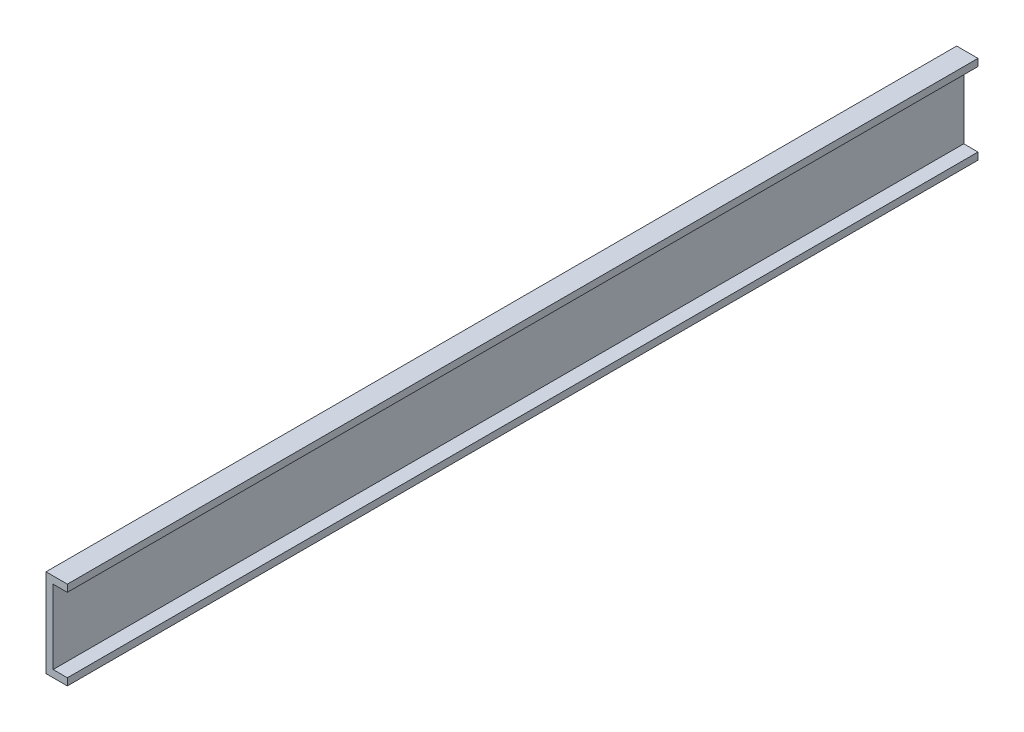
ISO-10303-21;
HEADER;
FILE_DESCRIPTION(('STEP AP214'),'2;1');
FILE_NAME('part.step','',(''),(''),'','','');
FILE_SCHEMA(('AUTOMOTIVE_DESIGN { 1 0 10303 214 1 1 1 1 }'));
ENDSEC;
DATA;
#1=APPLICATION_CONTEXT('core data for automotive mechanical design processes');
#2=APPLICATION_PROTOCOL_DEFINITION('international standard','automotive_design',2000,#1);
#3=PRODUCT_CONTEXT('',#1,'mechanical');
#4=PRODUCT('Part','Part','',(#3));
#5=PRODUCT_RELATED_PRODUCT_CATEGORY('part','',(#4));
#6=PRODUCT_DEFINITION_FORMATION('','',#4);
#7=PRODUCT_DEFINITION_CONTEXT('part definition',#1,'design');
#8=PRODUCT_DEFINITION('design','',#6,#7);
#9=PRODUCT_DEFINITION_SHAPE('','',#8);
#10=(LENGTH_UNIT() NAMED_UNIT(*) SI_UNIT(.MILLI.,.METRE.));
#11=(NAMED_UNIT(*) PLANE_ANGLE_UNIT() SI_UNIT($,.RADIAN.));
#12=(NAMED_UNIT(*) SI_UNIT($,.STERADIAN.) SOLID_ANGLE_UNIT());
#13=UNCERTAINTY_MEASURE_WITH_UNIT(LENGTH_MEASURE(1.E-05),#10,'distance_accuracy_value','');
#14=(GEOMETRIC_REPRESENTATION_CONTEXT(3) GLOBAL_UNCERTAINTY_ASSIGNED_CONTEXT((#13)) GLOBAL_UNIT_ASSIGNED_CONTEXT((#10,
#11,#12)) REPRESENTATION_CONTEXT('',''));
#15=CARTESIAN_POINT('',(0.,0.,0.));
#16=DIRECTION('',(0.,0.,1.));
#17=DIRECTION('',(1.,0.,0.));
#18=AXIS2_PLACEMENT_3D('',#15,#16,#17);
#19=CARTESIAN_POINT('',(9.525,0.,0.));
#20=DIRECTION('',(-1.,0.,0.));
#21=DIRECTION('',(0.,0.,1.));
#22=AXIS2_PLACEMENT_3D('',#19,#20,#21);
#23=PLANE('',#22);
#24=DIRECTION('',(0.,1.,0.));
#25=VECTOR('',#24,1.);
#26=CARTESIAN_POINT('',(9.525,0.,-406.4));
#27=LINE('',#26,#25);
#28=CARTESIAN_POINT('',(9.525,0.,-406.4));
#29=VERTEX_POINT('',#28);
#30=CARTESIAN_POINT('',(9.52500000000001,3.175,-406.4));
#31=VERTEX_POINT('',#30);
#32=EDGE_CURVE('E166',#29,#31,#27,.T.);
#33=ORIENTED_EDGE('',*,*,#32,.T.);
#34=DIRECTION('',(0.,0.,1.));
#35=VECTOR('',#34,1.);
#36=CARTESIAN_POINT('',(9.52500000000001,3.175,-406.4));
#37=LINE('',#36,#35);
#38=CARTESIAN_POINT('',(9.52500000000001,3.175,0.));
#39=VERTEX_POINT('',#38);
#40=EDGE_CURVE('E152',#31,#39,#37,.T.);
#41=ORIENTED_EDGE('',*,*,#40,.T.);
#42=DIRECTION('',(0.,-1.,0.));
#43=VECTOR('',#42,1.);
#44=CARTESIAN_POINT('',(9.525,0.,0.));
#45=LINE('',#44,#43);
#46=CARTESIAN_POINT('',(9.525,0.,0.));
#47=VERTEX_POINT('',#46);
#48=EDGE_CURVE('E93',#39,#47,#45,.T.);
#49=ORIENTED_EDGE('',*,*,#48,.T.);
#50=DIRECTION('',(0.,0.,-1.));
#51=VECTOR('',#50,1.);
#52=CARTESIAN_POINT('',(9.525,0.,0.));
#53=LINE('',#52,#51);
#54=EDGE_CURVE('E163',#47,#29,#53,.T.);
#55=ORIENTED_EDGE('',*,*,#54,.T.);
#56=EDGE_LOOP('',(#33,#41,#49,#55));
#57=FACE_BOUND('',#56,.T.);
#58=ADVANCED_FACE('F39',(#57),#23,.F.);
#59=CARTESIAN_POINT('',(9.525,0.,0.));
#60=DIRECTION('',(0.,0.,-1.));
#61=DIRECTION('',(-1.,0.,0.));
#62=AXIS2_PLACEMENT_3D('',#59,#60,#61);
#63=PLANE('',#62);
#64=ORIENTED_EDGE('',*,*,#48,.F.);
#65=DIRECTION('',(1.,0.,0.));
#66=VECTOR('',#65,1.);
#67=CARTESIAN_POINT('',(9.52500000000001,3.175,0.));
#68=LINE('',#67,#66);
#69=CARTESIAN_POINT('',(3.17500000000001,3.175,0.));
#70=VERTEX_POINT('',#69);
#71=EDGE_CURVE('E140',#70,#39,#68,.T.);
#72=ORIENTED_EDGE('',*,*,#71,.F.);
#73=DIRECTION('',(0.,-1.,0.));
#74=VECTOR('',#73,1.);
#75=CARTESIAN_POINT('',(3.175,36.195,0.));
#76=LINE('',#75,#74);
#77=CARTESIAN_POINT('',(3.175,36.195,0.));
#78=VERTEX_POINT('',#77);
#79=EDGE_CURVE('E143',#78,#70,#76,.T.);
#80=ORIENTED_EDGE('',*,*,#79,.F.);
#81=DIRECTION('',(-1.,0.,0.));
#82=VECTOR('',#81,1.);
#83=CARTESIAN_POINT('',(9.525,36.195,0.));
#84=LINE('',#83,#82);
#85=CARTESIAN_POINT('',(9.525,36.195,0.));
#86=VERTEX_POINT('',#85);
#87=EDGE_CURVE('E118',#86,#78,#84,.T.);
#88=ORIENTED_EDGE('',*,*,#87,.F.);
#89=CARTESIAN_POINT('',(9.525,39.37,0.));
#90=VERTEX_POINT('',#89);
#91=EDGE_CURVE('E160',#90,#86,#45,.T.);
#92=ORIENTED_EDGE('',*,*,#91,.F.);
#93=DIRECTION('',(-1.,0.,0.));
#94=VECTOR('',#93,1.);
#95=CARTESIAN_POINT('',(9.525,39.37,0.));
#96=LINE('',#95,#94);
#97=CARTESIAN_POINT('',(0.,39.37,0.));
#98=VERTEX_POINT('',#97);
#99=EDGE_CURVE('E172',#90,#98,#96,.T.);
#100=ORIENTED_EDGE('',*,*,#99,.T.);
#101=DIRECTION('',(0.,-1.,0.));
#102=VECTOR('',#101,1.);
#103=CARTESIAN_POINT('',(0.,0.,0.));
#104=LINE('',#103,#102);
#105=CARTESIAN_POINT('',(0.,0.,0.));
#106=VERTEX_POINT('',#105);
#107=EDGE_CURVE('E155',#98,#106,#104,.T.);
#108=ORIENTED_EDGE('',*,*,#107,.T.);
#109=DIRECTION('',(-1.,0.,0.));
#110=VECTOR('',#109,1.);
#111=CARTESIAN_POINT('',(9.525,0.,0.));
#112=LINE('',#111,#110);
#113=EDGE_CURVE('E11',#47,#106,#112,.T.);
#114=ORIENTED_EDGE('',*,*,#113,.F.);
#115=EDGE_LOOP('',(#64,#72,#80,#88,#92,#100,#108,#114));
#116=FACE_BOUND('',#115,.T.);
#117=ADVANCED_FACE('F41',(#116),#63,.F.);
#118=CARTESIAN_POINT('',(9.525,0.,0.));
#119=DIRECTION('',(0.,1.,0.));
#120=DIRECTION('',(0.,0.,1.));
#121=AXIS2_PLACEMENT_3D('',#118,#119,#120);
#122=PLANE('',#121);
#123=DIRECTION('',(0.,0.,-1.));
#124=VECTOR('',#123,1.);
#125=CARTESIAN_POINT('',(0.,0.,0.));
#126=LINE('',#125,#124);
#127=CARTESIAN_POINT('',(0.,0.,-406.4));
#128=VERTEX_POINT('',#127);
#129=EDGE_CURVE('E176',#106,#128,#126,.T.);
#130=ORIENTED_EDGE('',*,*,#129,.T.);
#131=DIRECTION('',(-1.,0.,0.));
#132=VECTOR('',#131,1.);
#133=CARTESIAN_POINT('',(9.525,0.,-406.4));
#134=LINE('',#133,#132);
#135=EDGE_CURVE('E48',#29,#128,#134,.T.);
#136=ORIENTED_EDGE('',*,*,#135,.F.);
#137=ORIENTED_EDGE('',*,*,#54,.F.);
#138=ORIENTED_EDGE('',*,*,#113,.T.);
#139=EDGE_LOOP('',(#130,#136,#137,#138));
#140=FACE_BOUND('',#139,.T.);
#141=ADVANCED_FACE('F209',(#140),#122,.F.);
#142=CARTESIAN_POINT('',(9.525,0.,-406.4));
#143=DIRECTION('',(0.,0.,1.));
#144=DIRECTION('',(1.,0.,0.));
#145=AXIS2_PLACEMENT_3D('',#142,#143,#144);
#146=PLANE('',#145);
#147=DIRECTION('',(0.,-1.,0.));
#148=VECTOR('',#147,1.);
#149=CARTESIAN_POINT('',(3.175,36.195,-406.4));
#150=LINE('',#149,#148);
#151=CARTESIAN_POINT('',(3.175,36.195,-406.4));
#152=VERTEX_POINT('',#151);
#153=CARTESIAN_POINT('',(3.17500000000001,3.175,-406.4));
#154=VERTEX_POINT('',#153);
#155=EDGE_CURVE('E127',#152,#154,#150,.T.);
#156=ORIENTED_EDGE('',*,*,#155,.T.);
#157=DIRECTION('',(1.,0.,0.));
#158=VECTOR('',#157,1.);
#159=CARTESIAN_POINT('',(9.52500000000001,3.175,-406.4));
#160=LINE('',#159,#158);
#161=EDGE_CURVE('E133',#154,#31,#160,.T.);
#162=ORIENTED_EDGE('',*,*,#161,.T.);
#163=ORIENTED_EDGE('',*,*,#32,.F.);
#164=ORIENTED_EDGE('',*,*,#135,.T.);
#165=DIRECTION('',(0.,1.,0.));
#166=VECTOR('',#165,1.);
#167=CARTESIAN_POINT('',(0.,0.,-406.4));
#168=LINE('',#167,#166);
#169=CARTESIAN_POINT('',(0.,39.37,-406.4));
#170=VERTEX_POINT('',#169);
#171=EDGE_CURVE('E179',#128,#170,#168,.T.);
#172=ORIENTED_EDGE('',*,*,#171,.T.);
#173=DIRECTION('',(-1.,0.,0.));
#174=VECTOR('',#173,1.);
#175=CARTESIAN_POINT('',(9.525,39.37,-406.4));
#176=LINE('',#175,#174);
#177=CARTESIAN_POINT('',(9.525,39.37,-406.4));
#178=VERTEX_POINT('',#177);
#179=EDGE_CURVE('E186',#178,#170,#176,.T.);
#180=ORIENTED_EDGE('',*,*,#179,.F.);
#181=CARTESIAN_POINT('',(9.525,36.195,-406.4));
#182=VERTEX_POINT('',#181);
#183=EDGE_CURVE('E138',#182,#178,#27,.T.);
#184=ORIENTED_EDGE('',*,*,#183,.F.);
#185=DIRECTION('',(-1.,0.,0.));
#186=VECTOR('',#185,1.);
#187=CARTESIAN_POINT('',(9.525,36.195,-406.4));
#188=LINE('',#187,#186);
#189=EDGE_CURVE('E55',#182,#152,#188,.T.);
#190=ORIENTED_EDGE('',*,*,#189,.T.);
#191=EDGE_LOOP('',(#156,#162,#163,#164,#172,#180,#184,#190));
#192=FACE_BOUND('',#191,.T.);
#193=ADVANCED_FACE('F136',(#192),#146,.F.);
#194=CARTESIAN_POINT('',(9.525,39.37,0.));
#195=DIRECTION('',(0.,-1.,0.));
#196=DIRECTION('',(0.,0.,-1.));
#197=AXIS2_PLACEMENT_3D('',#194,#195,#196);
#198=PLANE('',#197);
#199=DIRECTION('',(0.,0.,1.));
#200=VECTOR('',#199,1.);
#201=CARTESIAN_POINT('',(0.,39.37,0.));
#202=LINE('',#201,#200);
#203=EDGE_CURVE('E85',#170,#98,#202,.T.);
#204=ORIENTED_EDGE('',*,*,#203,.T.);
#205=ORIENTED_EDGE('',*,*,#99,.F.);
#206=DIRECTION('',(0.,0.,1.));
#207=VECTOR('',#206,1.);
#208=CARTESIAN_POINT('',(9.525,39.37,0.));
#209=LINE('',#208,#207);
#210=EDGE_CURVE('E64',#178,#90,#209,.T.);
#211=ORIENTED_EDGE('',*,*,#210,.F.);
#212=ORIENTED_EDGE('',*,*,#179,.T.);
#213=EDGE_LOOP('',(#204,#205,#211,#212));
#214=FACE_BOUND('',#213,.T.);
#215=ADVANCED_FACE('F200',(#214),#198,.F.);
#216=ORIENTED_EDGE('',*,*,#91,.T.);
#217=DIRECTION('',(0.,0.,1.));
#218=VECTOR('',#217,1.);
#219=CARTESIAN_POINT('',(9.525,36.195,-406.4));
#220=LINE('',#219,#218);
#221=EDGE_CURVE('E124',#182,#86,#220,.T.);
#222=ORIENTED_EDGE('',*,*,#221,.F.);
#223=ORIENTED_EDGE('',*,*,#183,.T.);
#224=ORIENTED_EDGE('',*,*,#210,.T.);
#225=EDGE_LOOP('',(#216,#222,#223,#224));
#226=FACE_BOUND('',#225,.T.);
#227=ADVANCED_FACE('F202',(#226),#23,.F.);
#228=CARTESIAN_POINT('',(0.,0.,0.));
#229=DIRECTION('',(-1.,0.,0.));
#230=DIRECTION('',(0.,0.,1.));
#231=AXIS2_PLACEMENT_3D('',#228,#229,#230);
#232=PLANE('',#231);
#233=ORIENTED_EDGE('',*,*,#107,.F.);
#234=ORIENTED_EDGE('',*,*,#203,.F.);
#235=ORIENTED_EDGE('',*,*,#171,.F.);
#236=ORIENTED_EDGE('',*,*,#129,.F.);
#237=EDGE_LOOP('',(#233,#234,#235,#236));
#238=FACE_BOUND('',#237,.T.);
#239=ADVANCED_FACE('F196',(#238),#232,.T.);
#240=CARTESIAN_POINT('',(9.52500000000001,3.175,-406.4));
#241=DIRECTION('',(0.,-1.,0.));
#242=DIRECTION('',(1.,0.,0.));
#243=AXIS2_PLACEMENT_3D('',#240,#241,#242);
#244=PLANE('',#243);
#245=ORIENTED_EDGE('',*,*,#71,.T.);
#246=ORIENTED_EDGE('',*,*,#40,.F.);
#247=ORIENTED_EDGE('',*,*,#161,.F.);
#248=DIRECTION('',(0.,0.,1.));
#249=VECTOR('',#248,1.);
#250=CARTESIAN_POINT('',(3.17500000000001,3.175,-406.4));
#251=LINE('',#250,#249);
#252=EDGE_CURVE('E123',#154,#70,#251,.T.);
#253=ORIENTED_EDGE('',*,*,#252,.T.);
#254=EDGE_LOOP('',(#245,#246,#247,#253));
#255=FACE_BOUND('',#254,.T.);
#256=ADVANCED_FACE('F219',(#255),#244,.F.);
#257=CARTESIAN_POINT('',(3.175,36.195,-406.4));
#258=DIRECTION('',(-1.,0.,0.));
#259=DIRECTION('',(0.,-1.,0.));
#260=AXIS2_PLACEMENT_3D('',#257,#258,#259);
#261=PLANE('',#260);
#262=ORIENTED_EDGE('',*,*,#79,.T.);
#263=ORIENTED_EDGE('',*,*,#252,.F.);
#264=ORIENTED_EDGE('',*,*,#155,.F.);
#265=DIRECTION('',(0.,0.,1.));
#266=VECTOR('',#265,1.);
#267=CARTESIAN_POINT('',(3.175,36.195,-406.4));
#268=LINE('',#267,#266);
#269=EDGE_CURVE('E114',#152,#78,#268,.T.);
#270=ORIENTED_EDGE('',*,*,#269,.T.);
#271=EDGE_LOOP('',(#262,#263,#264,#270));
#272=FACE_BOUND('',#271,.T.);
#273=ADVANCED_FACE('F128',(#272),#261,.F.);
#274=CARTESIAN_POINT('',(9.525,36.195,-406.4));
#275=DIRECTION('',(0.,1.,0.));
#276=DIRECTION('',(0.,0.,1.));
#277=AXIS2_PLACEMENT_3D('',#274,#275,#276);
#278=PLANE('',#277);
#279=ORIENTED_EDGE('',*,*,#87,.T.);
#280=ORIENTED_EDGE('',*,*,#269,.F.);
#281=ORIENTED_EDGE('',*,*,#189,.F.);
#282=ORIENTED_EDGE('',*,*,#221,.T.);
#283=EDGE_LOOP('',(#279,#280,#281,#282));
#284=FACE_BOUND('',#283,.T.);
#285=ADVANCED_FACE('F116',(#284),#278,.F.);
#286=CLOSED_SHELL('',(#58,#117,#141,#193,#215,#227,#239,#256,#273,#285));
#287=MANIFOLD_SOLID_BREP('B2',#286);
#288=ADVANCED_BREP_SHAPE_REPRESENTATION('',(#18,#287),#14);
#289=SHAPE_DEFINITION_REPRESENTATION(#9,#288);
ENDSEC;
END-ISO-10303-21;
